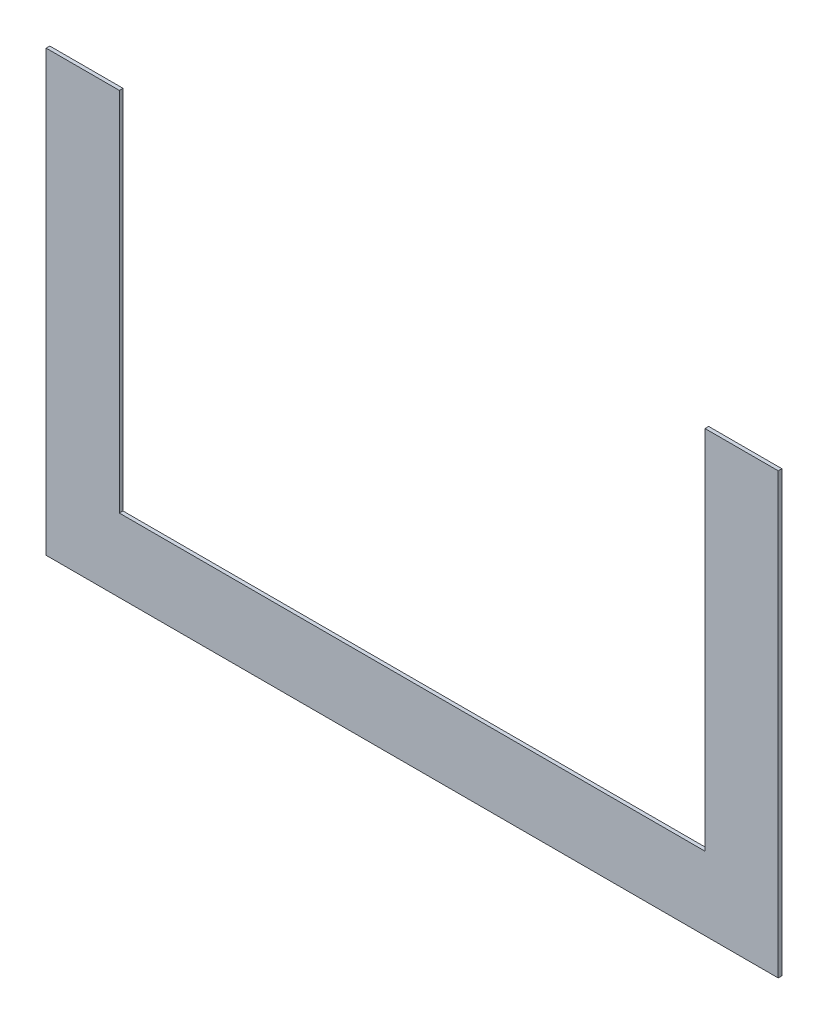
ISO-10303-21;
HEADER;
FILE_DESCRIPTION(('STEP AP214'),'2;1');
FILE_NAME('part.step','',(''),(''),'','','');
FILE_SCHEMA(('AUTOMOTIVE_DESIGN { 1 0 10303 214 1 1 1 1 }'));
ENDSEC;
DATA;
#1=APPLICATION_CONTEXT('core data for automotive mechanical design processes');
#2=APPLICATION_PROTOCOL_DEFINITION('international standard','automotive_design',2000,#1);
#3=PRODUCT_CONTEXT('',#1,'mechanical');
#4=PRODUCT('Part','Part','',(#3));
#5=PRODUCT_RELATED_PRODUCT_CATEGORY('part','',(#4));
#6=PRODUCT_DEFINITION_FORMATION('','',#4);
#7=PRODUCT_DEFINITION_CONTEXT('part definition',#1,'design');
#8=PRODUCT_DEFINITION('design','',#6,#7);
#9=PRODUCT_DEFINITION_SHAPE('','',#8);
#10=(LENGTH_UNIT() NAMED_UNIT(*) SI_UNIT(.MILLI.,.METRE.));
#11=(NAMED_UNIT(*) PLANE_ANGLE_UNIT() SI_UNIT($,.RADIAN.));
#12=(NAMED_UNIT(*) SI_UNIT($,.STERADIAN.) SOLID_ANGLE_UNIT());
#13=UNCERTAINTY_MEASURE_WITH_UNIT(LENGTH_MEASURE(1.E-05),#10,'distance_accuracy_value','');
#14=(GEOMETRIC_REPRESENTATION_CONTEXT(3) GLOBAL_UNCERTAINTY_ASSIGNED_CONTEXT((#13)) GLOBAL_UNIT_ASSIGNED_CONTEXT((#10,
#11,#12)) REPRESENTATION_CONTEXT('',''));
#15=CARTESIAN_POINT('',(0.,0.,0.));
#16=DIRECTION('',(0.,0.,1.));
#17=DIRECTION('',(1.,0.,0.));
#18=AXIS2_PLACEMENT_3D('',#15,#16,#17);
#19=CARTESIAN_POINT('',(-240.483025281158,47.1872916795091,2.54));
#20=DIRECTION('',(-1.,0.,0.));
#21=DIRECTION('',(0.,0.,1.));
#22=AXIS2_PLACEMENT_3D('',#19,#20,#21);
#23=PLANE('',#22);
#24=DIRECTION('',(0.,1.,0.));
#25=VECTOR('',#24,1.);
#26=CARTESIAN_POINT('',(-240.483025281158,47.1872916795091,0.));
#27=LINE('',#26,#25);
#28=CARTESIAN_POINT('',(-240.483025281158,47.1872916795091,0.));
#29=VERTEX_POINT('',#28);
#30=CARTESIAN_POINT('',(-240.483025281158,301.187291679509,0.));
#31=VERTEX_POINT('',#30);
#32=EDGE_CURVE('E129',#29,#31,#27,.T.);
#33=ORIENTED_EDGE('',*,*,#32,.T.);
#34=DIRECTION('',(0.,0.,-1.));
#35=VECTOR('',#34,1.);
#36=CARTESIAN_POINT('',(-240.483025281158,301.187291679509,2.54));
#37=LINE('',#36,#35);
#38=CARTESIAN_POINT('',(-240.483025281158,301.187291679509,2.54));
#39=VERTEX_POINT('',#38);
#40=EDGE_CURVE('E11',#39,#31,#37,.T.);
#41=ORIENTED_EDGE('',*,*,#40,.F.);
#42=DIRECTION('',(0.,1.,0.));
#43=VECTOR('',#42,1.);
#44=CARTESIAN_POINT('',(-240.483025281158,47.1872916795091,2.54));
#45=LINE('',#44,#43);
#46=CARTESIAN_POINT('',(-240.483025281158,47.1872916795091,2.54));
#47=VERTEX_POINT('',#46);
#48=EDGE_CURVE('E144',#47,#39,#45,.T.);
#49=ORIENTED_EDGE('',*,*,#48,.F.);
#50=DIRECTION('',(0.,0.,-1.));
#51=VECTOR('',#50,1.);
#52=CARTESIAN_POINT('',(-240.483025281158,47.1872916795091,2.54));
#53=LINE('',#52,#51);
#54=EDGE_CURVE('E125',#47,#29,#53,.T.);
#55=ORIENTED_EDGE('',*,*,#54,.T.);
#56=EDGE_LOOP('',(#33,#41,#49,#55));
#57=FACE_BOUND('',#56,.T.);
#58=ADVANCED_FACE('F33',(#57),#23,.F.);
#59=CARTESIAN_POINT('',(-240.483025281158,301.187291679509,2.54));
#60=DIRECTION('',(0.,-1.,0.));
#61=DIRECTION('',(1.,0.,0.));
#62=AXIS2_PLACEMENT_3D('',#59,#60,#61);
#63=PLANE('',#62);
#64=DIRECTION('',(-1.,0.,0.));
#65=VECTOR('',#64,1.);
#66=CARTESIAN_POINT('',(-240.483025281158,301.187291679509,0.));
#67=LINE('',#66,#65);
#68=CARTESIAN_POINT('',(-291.283025281158,301.187291679509,0.));
#69=VERTEX_POINT('',#68);
#70=EDGE_CURVE('E132',#31,#69,#67,.T.);
#71=ORIENTED_EDGE('',*,*,#70,.T.);
#72=DIRECTION('',(0.,0.,-1.));
#73=VECTOR('',#72,1.);
#74=CARTESIAN_POINT('',(-291.283025281158,301.187291679509,2.54));
#75=LINE('',#74,#73);
#76=CARTESIAN_POINT('',(-291.283025281158,301.187291679509,2.54));
#77=VERTEX_POINT('',#76);
#78=EDGE_CURVE('E41',#77,#69,#75,.T.);
#79=ORIENTED_EDGE('',*,*,#78,.F.);
#80=DIRECTION('',(-1.,0.,0.));
#81=VECTOR('',#80,1.);
#82=CARTESIAN_POINT('',(-240.483025281158,301.187291679509,2.54));
#83=LINE('',#82,#81);
#84=EDGE_CURVE('E92',#39,#77,#83,.T.);
#85=ORIENTED_EDGE('',*,*,#84,.F.);
#86=ORIENTED_EDGE('',*,*,#40,.T.);
#87=EDGE_LOOP('',(#71,#79,#85,#86));
#88=FACE_BOUND('',#87,.T.);
#89=ADVANCED_FACE('F178',(#88),#63,.F.);
#90=CARTESIAN_POINT('',(-291.283025281158,-3.61270832049092,2.54));
#91=DIRECTION('',(1.,0.,0.));
#92=DIRECTION('',(0.,0.,-1.));
#93=AXIS2_PLACEMENT_3D('',#90,#91,#92);
#94=PLANE('',#93);
#95=DIRECTION('',(0.,-1.,0.));
#96=VECTOR('',#95,1.);
#97=CARTESIAN_POINT('',(-291.283025281158,-3.61270832049092,0.));
#98=LINE('',#97,#96);
#99=CARTESIAN_POINT('',(-291.283025281158,-3.61270832049092,0.));
#100=VERTEX_POINT('',#99);
#101=EDGE_CURVE('E134',#69,#100,#98,.T.);
#102=ORIENTED_EDGE('',*,*,#101,.T.);
#103=DIRECTION('',(0.,0.,-1.));
#104=VECTOR('',#103,1.);
#105=CARTESIAN_POINT('',(-291.283025281158,-3.61270832049092,2.54));
#106=LINE('',#105,#104);
#107=CARTESIAN_POINT('',(-291.283025281158,-3.61270832049092,2.54));
#108=VERTEX_POINT('',#107);
#109=EDGE_CURVE('E151',#108,#100,#106,.T.);
#110=ORIENTED_EDGE('',*,*,#109,.F.);
#111=DIRECTION('',(0.,-1.,0.));
#112=VECTOR('',#111,1.);
#113=CARTESIAN_POINT('',(-291.283025281158,-3.61270832049092,2.54));
#114=LINE('',#113,#112);
#115=EDGE_CURVE('E159',#77,#108,#114,.T.);
#116=ORIENTED_EDGE('',*,*,#115,.F.);
#117=ORIENTED_EDGE('',*,*,#78,.T.);
#118=EDGE_LOOP('',(#102,#110,#116,#117));
#119=FACE_BOUND('',#118,.T.);
#120=ADVANCED_FACE('F157',(#119),#94,.F.);
#121=CARTESIAN_POINT('',(165.916974718842,-3.61270832049092,2.54));
#122=DIRECTION('',(0.,1.,0.));
#123=DIRECTION('',(0.,0.,1.));
#124=AXIS2_PLACEMENT_3D('',#121,#122,#123);
#125=PLANE('',#124);
#126=DIRECTION('',(1.,0.,0.));
#127=VECTOR('',#126,1.);
#128=CARTESIAN_POINT('',(165.916974718842,-3.61270832049092,0.));
#129=LINE('',#128,#127);
#130=CARTESIAN_POINT('',(216.716974718842,-3.61270832049092,0.));
#131=VERTEX_POINT('',#130);
#132=EDGE_CURVE('E137',#100,#131,#129,.T.);
#133=ORIENTED_EDGE('',*,*,#132,.T.);
#134=DIRECTION('',(0.,0.,-1.));
#135=VECTOR('',#134,1.);
#136=CARTESIAN_POINT('',(216.716974718842,-3.61270832049092,2.54));
#137=LINE('',#136,#135);
#138=CARTESIAN_POINT('',(216.716974718842,-3.61270832049092,2.54));
#139=VERTEX_POINT('',#138);
#140=EDGE_CURVE('E148',#139,#131,#137,.T.);
#141=ORIENTED_EDGE('',*,*,#140,.F.);
#142=DIRECTION('',(1.,0.,0.));
#143=VECTOR('',#142,1.);
#144=CARTESIAN_POINT('',(-240.483025281158,-3.61270832049092,2.54));
#145=LINE('',#144,#143);
#146=EDGE_CURVE('E170',#108,#139,#145,.T.);
#147=ORIENTED_EDGE('',*,*,#146,.F.);
#148=ORIENTED_EDGE('',*,*,#109,.T.);
#149=EDGE_LOOP('',(#133,#141,#147,#148));
#150=FACE_BOUND('',#149,.T.);
#151=ADVANCED_FACE('F166',(#150),#125,.F.);
#152=CARTESIAN_POINT('',(216.716974718842,-3.61270832049092,2.54));
#153=DIRECTION('',(-1.,0.,0.));
#154=DIRECTION('',(0.,0.,1.));
#155=AXIS2_PLACEMENT_3D('',#152,#153,#154);
#156=PLANE('',#155);
#157=DIRECTION('',(0.,1.,0.));
#158=VECTOR('',#157,1.);
#159=CARTESIAN_POINT('',(216.716974718842,-3.61270832049092,0.));
#160=LINE('',#159,#158);
#161=CARTESIAN_POINT('',(216.716974718842,301.187291679509,0.));
#162=VERTEX_POINT('',#161);
#163=EDGE_CURVE('E139',#131,#162,#160,.T.);
#164=ORIENTED_EDGE('',*,*,#163,.T.);
#165=DIRECTION('',(0.,0.,-1.));
#166=VECTOR('',#165,1.);
#167=CARTESIAN_POINT('',(216.716974718842,301.187291679509,2.54));
#168=LINE('',#167,#166);
#169=CARTESIAN_POINT('',(216.716974718842,301.187291679509,2.54));
#170=VERTEX_POINT('',#169);
#171=EDGE_CURVE('E120',#170,#162,#168,.T.);
#172=ORIENTED_EDGE('',*,*,#171,.F.);
#173=DIRECTION('',(0.,1.,0.));
#174=VECTOR('',#173,1.);
#175=CARTESIAN_POINT('',(216.716974718842,-3.61270832049092,2.54));
#176=LINE('',#175,#174);
#177=EDGE_CURVE('E111',#139,#170,#176,.T.);
#178=ORIENTED_EDGE('',*,*,#177,.F.);
#179=ORIENTED_EDGE('',*,*,#140,.T.);
#180=EDGE_LOOP('',(#164,#172,#178,#179));
#181=FACE_BOUND('',#180,.T.);
#182=ADVANCED_FACE('F169',(#181),#156,.F.);
#183=CARTESIAN_POINT('',(165.916974718842,301.187291679509,2.54));
#184=DIRECTION('',(0.,-1.,0.));
#185=DIRECTION('',(0.,0.,-1.));
#186=AXIS2_PLACEMENT_3D('',#183,#184,#185);
#187=PLANE('',#186);
#188=DIRECTION('',(-1.,0.,0.));
#189=VECTOR('',#188,1.);
#190=CARTESIAN_POINT('',(165.916974718842,301.187291679509,0.));
#191=LINE('',#190,#189);
#192=CARTESIAN_POINT('',(165.916974718842,301.187291679509,0.));
#193=VERTEX_POINT('',#192);
#194=EDGE_CURVE('E119',#162,#193,#191,.T.);
#195=ORIENTED_EDGE('',*,*,#194,.T.);
#196=DIRECTION('',(0.,0.,-1.));
#197=VECTOR('',#196,1.);
#198=CARTESIAN_POINT('',(165.916974718842,301.187291679509,2.54));
#199=LINE('',#198,#197);
#200=CARTESIAN_POINT('',(165.916974718842,301.187291679509,2.54));
#201=VERTEX_POINT('',#200);
#202=EDGE_CURVE('E116',#201,#193,#199,.T.);
#203=ORIENTED_EDGE('',*,*,#202,.F.);
#204=DIRECTION('',(-1.,0.,0.));
#205=VECTOR('',#204,1.);
#206=CARTESIAN_POINT('',(165.916974718842,301.187291679509,2.54));
#207=LINE('',#206,#205);
#208=EDGE_CURVE('E105',#170,#201,#207,.T.);
#209=ORIENTED_EDGE('',*,*,#208,.F.);
#210=ORIENTED_EDGE('',*,*,#171,.T.);
#211=EDGE_LOOP('',(#195,#203,#209,#210));
#212=FACE_BOUND('',#211,.T.);
#213=ADVANCED_FACE('F117',(#212),#187,.F.);
#214=CARTESIAN_POINT('',(165.916974718842,47.1872916795091,2.54));
#215=DIRECTION('',(1.,0.,0.));
#216=DIRECTION('',(0.,0.,-1.));
#217=AXIS2_PLACEMENT_3D('',#214,#215,#216);
#218=PLANE('',#217);
#219=DIRECTION('',(0.,-1.,0.));
#220=VECTOR('',#219,1.);
#221=CARTESIAN_POINT('',(165.916974718842,47.1872916795091,0.));
#222=LINE('',#221,#220);
#223=CARTESIAN_POINT('',(165.916974718842,47.1872916795091,0.));
#224=VERTEX_POINT('',#223);
#225=EDGE_CURVE('E78',#193,#224,#222,.T.);
#226=ORIENTED_EDGE('',*,*,#225,.T.);
#227=DIRECTION('',(0.,0.,-1.));
#228=VECTOR('',#227,1.);
#229=CARTESIAN_POINT('',(165.916974718842,47.1872916795091,2.54));
#230=LINE('',#229,#228);
#231=CARTESIAN_POINT('',(165.916974718842,47.1872916795091,2.54));
#232=VERTEX_POINT('',#231);
#233=EDGE_CURVE('E121',#232,#224,#230,.T.);
#234=ORIENTED_EDGE('',*,*,#233,.F.);
#235=DIRECTION('',(0.,-1.,0.));
#236=VECTOR('',#235,1.);
#237=CARTESIAN_POINT('',(165.916974718842,47.1872916795091,2.54));
#238=LINE('',#237,#236);
#239=EDGE_CURVE('E109',#201,#232,#238,.T.);
#240=ORIENTED_EDGE('',*,*,#239,.F.);
#241=ORIENTED_EDGE('',*,*,#202,.T.);
#242=EDGE_LOOP('',(#226,#234,#240,#241));
#243=FACE_BOUND('',#242,.T.);
#244=ADVANCED_FACE('F123',(#243),#218,.F.);
#245=CARTESIAN_POINT('',(-240.483025281158,47.1872916795091,2.54));
#246=DIRECTION('',(0.,-1.,0.));
#247=DIRECTION('',(0.,0.,-1.));
#248=AXIS2_PLACEMENT_3D('',#245,#246,#247);
#249=PLANE('',#248);
#250=DIRECTION('',(-1.,0.,0.));
#251=VECTOR('',#250,1.);
#252=CARTESIAN_POINT('',(-240.483025281158,47.1872916795091,0.));
#253=LINE('',#252,#251);
#254=EDGE_CURVE('E84',#224,#29,#253,.T.);
#255=ORIENTED_EDGE('',*,*,#254,.T.);
#256=ORIENTED_EDGE('',*,*,#54,.F.);
#257=DIRECTION('',(-1.,0.,0.));
#258=VECTOR('',#257,1.);
#259=CARTESIAN_POINT('',(-240.483025281158,47.1872916795091,2.54));
#260=LINE('',#259,#258);
#261=EDGE_CURVE('E49',#232,#47,#260,.T.);
#262=ORIENTED_EDGE('',*,*,#261,.F.);
#263=ORIENTED_EDGE('',*,*,#233,.T.);
#264=EDGE_LOOP('',(#255,#256,#262,#263));
#265=FACE_BOUND('',#264,.T.);
#266=ADVANCED_FACE('F194',(#265),#249,.F.);
#267=CARTESIAN_POINT('',(0.,0.,2.54));
#268=DIRECTION('',(0.,0.,1.));
#269=DIRECTION('',(1.,0.,0.));
#270=AXIS2_PLACEMENT_3D('',#267,#268,#269);
#271=PLANE('',#270);
#272=ORIENTED_EDGE('',*,*,#48,.T.);
#273=ORIENTED_EDGE('',*,*,#84,.T.);
#274=ORIENTED_EDGE('',*,*,#115,.T.);
#275=ORIENTED_EDGE('',*,*,#146,.T.);
#276=ORIENTED_EDGE('',*,*,#177,.T.);
#277=ORIENTED_EDGE('',*,*,#208,.T.);
#278=ORIENTED_EDGE('',*,*,#239,.T.);
#279=ORIENTED_EDGE('',*,*,#261,.T.);
#280=EDGE_LOOP('',(#272,#273,#274,#275,#276,#277,#278,#279));
#281=FACE_BOUND('',#280,.T.);
#282=ADVANCED_FACE('F107',(#281),#271,.T.);
#283=CARTESIAN_POINT('',(0.,0.,0.));
#284=DIRECTION('',(0.,0.,1.));
#285=DIRECTION('',(1.,0.,0.));
#286=AXIS2_PLACEMENT_3D('',#283,#284,#285);
#287=PLANE('',#286);
#288=ORIENTED_EDGE('',*,*,#32,.F.);
#289=ORIENTED_EDGE('',*,*,#254,.F.);
#290=ORIENTED_EDGE('',*,*,#225,.F.);
#291=ORIENTED_EDGE('',*,*,#194,.F.);
#292=ORIENTED_EDGE('',*,*,#163,.F.);
#293=ORIENTED_EDGE('',*,*,#132,.F.);
#294=ORIENTED_EDGE('',*,*,#101,.F.);
#295=ORIENTED_EDGE('',*,*,#70,.F.);
#296=EDGE_LOOP('',(#288,#289,#290,#291,#292,#293,#294,#295));
#297=FACE_BOUND('',#296,.T.);
#298=ADVANCED_FACE('F162',(#297),#287,.F.);
#299=CLOSED_SHELL('',(#58,#89,#120,#151,#182,#213,#244,#266,#282,#298));
#300=MANIFOLD_SOLID_BREP('B2',#299);
#301=ADVANCED_BREP_SHAPE_REPRESENTATION('',(#18,#300),#14);
#302=SHAPE_DEFINITION_REPRESENTATION(#9,#301);
ENDSEC;
END-ISO-10303-21;
